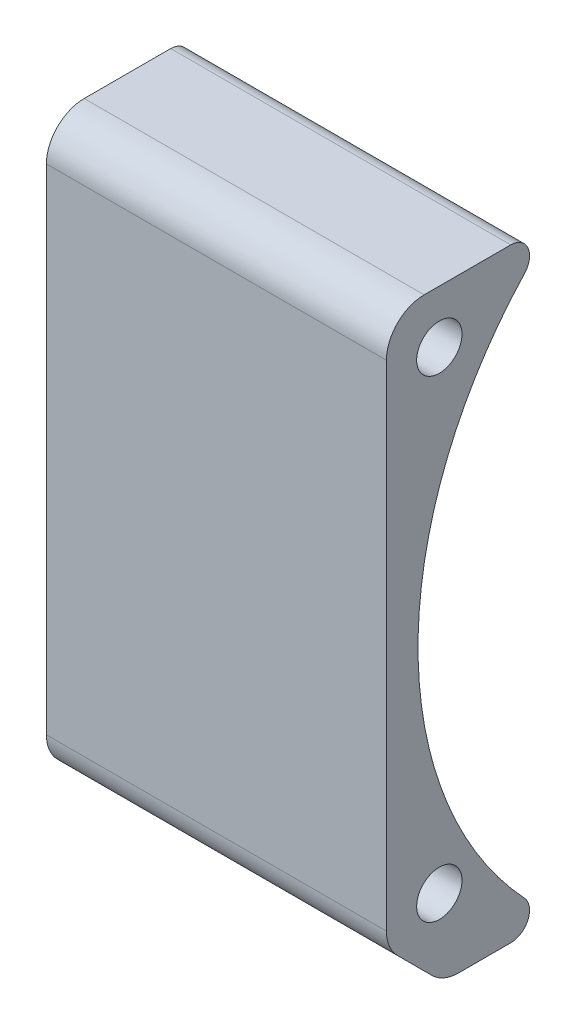
ISO-10303-21;
HEADER;
FILE_DESCRIPTION(('STEP AP214'),'2;1');
FILE_NAME('part.step','',(''),(''),'','','');
FILE_SCHEMA(('AUTOMOTIVE_DESIGN { 1 0 10303 214 1 1 1 1 }'));
ENDSEC;
DATA;
#1=APPLICATION_CONTEXT('core data for automotive mechanical design processes');
#2=APPLICATION_PROTOCOL_DEFINITION('international standard','automotive_design',2000,#1);
#3=PRODUCT_CONTEXT('',#1,'mechanical');
#4=PRODUCT('Part','Part','',(#3));
#5=PRODUCT_RELATED_PRODUCT_CATEGORY('part','',(#4));
#6=PRODUCT_DEFINITION_FORMATION('','',#4);
#7=PRODUCT_DEFINITION_CONTEXT('part definition',#1,'design');
#8=PRODUCT_DEFINITION('design','',#6,#7);
#9=PRODUCT_DEFINITION_SHAPE('','',#8);
#10=(LENGTH_UNIT() NAMED_UNIT(*) SI_UNIT(.MILLI.,.METRE.));
#11=(NAMED_UNIT(*) PLANE_ANGLE_UNIT() SI_UNIT($,.RADIAN.));
#12=(NAMED_UNIT(*) SI_UNIT($,.STERADIAN.) SOLID_ANGLE_UNIT());
#13=UNCERTAINTY_MEASURE_WITH_UNIT(LENGTH_MEASURE(1.E-05),#10,'distance_accuracy_value','');
#14=(GEOMETRIC_REPRESENTATION_CONTEXT(3) GLOBAL_UNCERTAINTY_ASSIGNED_CONTEXT((#13)) GLOBAL_UNIT_ASSIGNED_CONTEXT((#10,
#11,#12)) REPRESENTATION_CONTEXT('',''));
#15=CARTESIAN_POINT('',(0.,0.,0.));
#16=DIRECTION('',(0.,0.,1.));
#17=DIRECTION('',(1.,0.,0.));
#18=AXIS2_PLACEMENT_3D('',#15,#16,#17);
#19=CARTESIAN_POINT('',(28.575,0.,0.));
#20=DIRECTION('',(0.,1.,0.));
#21=DIRECTION('',(0.,0.,1.));
#22=AXIS2_PLACEMENT_3D('',#19,#20,#21);
#23=PLANE('',#22);
#24=DIRECTION('',(0.,0.,-1.));
#25=VECTOR('',#24,1.);
#26=CARTESIAN_POINT('',(0.,0.,0.));
#27=LINE('',#26,#25);
#28=CARTESIAN_POINT('',(0.,0.,-6.07762806053458));
#29=VERTEX_POINT('',#28);
#30=CARTESIAN_POINT('',(0.,0.,-10.4436943528125));
#31=VERTEX_POINT('',#30);
#32=EDGE_CURVE('E220',#29,#31,#27,.T.);
#33=ORIENTED_EDGE('',*,*,#32,.T.);
#34=DIRECTION('',(-1.,0.,0.));
#35=VECTOR('',#34,1.);
#36=CARTESIAN_POINT('',(28.575,0.,-10.4436943528125));
#37=LINE('',#36,#35);
#38=CARTESIAN_POINT('',(28.575,0.,-10.4436943528125));
#39=VERTEX_POINT('',#38);
#40=EDGE_CURVE('E11',#31,#39,#37,.F.);
#41=ORIENTED_EDGE('',*,*,#40,.T.);
#42=DIRECTION('',(0.,0.,-1.));
#43=VECTOR('',#42,1.);
#44=CARTESIAN_POINT('',(28.575,0.,0.));
#45=LINE('',#44,#43);
#46=CARTESIAN_POINT('',(28.575,0.,-6.07762806053458));
#47=VERTEX_POINT('',#46);
#48=EDGE_CURVE('E161',#47,#39,#45,.T.);
#49=ORIENTED_EDGE('',*,*,#48,.F.);
#50=DIRECTION('',(1.,0.,0.));
#51=VECTOR('',#50,1.);
#52=CARTESIAN_POINT('',(0.,0.,-6.07762806053458));
#53=LINE('',#52,#51);
#54=EDGE_CURVE('E187',#47,#29,#53,.F.);
#55=ORIENTED_EDGE('',*,*,#54,.T.);
#56=EDGE_LOOP('',(#33,#41,#49,#55));
#57=FACE_BOUND('',#56,.T.);
#58=ADVANCED_FACE('F51',(#57),#23,.F.);
#59=CARTESIAN_POINT('',(28.575,25.4,-35.9920889941593));
#60=DIRECTION('',(-1.,0.,0.));
#61=DIRECTION('',(0.,0.,1.));
#62=AXIS2_PLACEMENT_3D('',#59,#60,#61);
#63=CYLINDRICAL_SURFACE('',#62,33.3375);
#64=CARTESIAN_POINT('',(0.,25.4,-35.9920889941593));
#65=DIRECTION('',(-1.,0.,0.));
#66=DIRECTION('',(0.,0.,-1.));
#67=AXIS2_PLACEMENT_3D('',#64,#65,#66);
#68=CIRCLE('',#67,33.3375);
#69=CARTESIAN_POINT('',(0.,2.66988636363636,-11.6049850183283));
#70=VERTEX_POINT('',#69);
#71=CARTESIAN_POINT('',(0.,48.1301136363636,-11.6049850183282));
#72=VERTEX_POINT('',#71);
#73=EDGE_CURVE('E167',#70,#72,#68,.T.);
#74=ORIENTED_EDGE('',*,*,#73,.T.);
#75=DIRECTION('',(-1.,0.,0.));
#76=VECTOR('',#75,1.);
#77=CARTESIAN_POINT('',(28.575,48.1301136363636,-11.6049850183282));
#78=LINE('',#77,#76);
#79=CARTESIAN_POINT('',(28.575,48.1301136363636,-11.6049850183282));
#80=VERTEX_POINT('',#79);
#81=EDGE_CURVE('E72',#72,#80,#78,.F.);
#82=ORIENTED_EDGE('',*,*,#81,.T.);
#83=CARTESIAN_POINT('',(28.575,25.4,-35.9920889941593));
#84=DIRECTION('',(-1.,0.,0.));
#85=DIRECTION('',(0.,0.,-1.));
#86=AXIS2_PLACEMENT_3D('',#83,#84,#85);
#87=CIRCLE('',#86,33.3375);
#88=CARTESIAN_POINT('',(28.575,2.66988636363636,-11.6049850183283));
#89=VERTEX_POINT('',#88);
#90=EDGE_CURVE('E164',#89,#80,#87,.T.);
#91=ORIENTED_EDGE('',*,*,#90,.F.);
#92=DIRECTION('',(-1.,0.,0.));
#93=VECTOR('',#92,1.);
#94=CARTESIAN_POINT('',(28.575,2.66988636363636,-11.6049850183283));
#95=LINE('',#94,#93);
#96=EDGE_CURVE('E200',#89,#70,#95,.T.);
#97=ORIENTED_EDGE('',*,*,#96,.T.);
#98=EDGE_LOOP('',(#74,#82,#91,#97));
#99=FACE_BOUND('',#98,.T.);
#100=ADVANCED_FACE('F217',(#99),#63,.F.);
#101=CARTESIAN_POINT('',(28.575,50.8,0.));
#102=DIRECTION('',(0.,-1.,0.));
#103=DIRECTION('',(0.,0.,-1.));
#104=AXIS2_PLACEMENT_3D('',#101,#102,#103);
#105=PLANE('',#104);
#106=DIRECTION('',(0.,0.,1.));
#107=VECTOR('',#106,1.);
#108=CARTESIAN_POINT('',(28.575,50.8,0.));
#109=LINE('',#108,#107);
#110=CARTESIAN_POINT('',(28.575,50.8,-10.4436943528125));
#111=VERTEX_POINT('',#110);
#112=CARTESIAN_POINT('',(28.575,50.8,-3.175));
#113=VERTEX_POINT('',#112);
#114=EDGE_CURVE('E209',#111,#113,#109,.T.);
#115=ORIENTED_EDGE('',*,*,#114,.F.);
#116=DIRECTION('',(-1.,0.,0.));
#117=VECTOR('',#116,1.);
#118=CARTESIAN_POINT('',(28.575,50.8,-10.4436943528125));
#119=LINE('',#118,#117);
#120=CARTESIAN_POINT('',(0.,50.8,-10.4436943528125));
#121=VERTEX_POINT('',#120);
#122=EDGE_CURVE('E191',#111,#121,#119,.T.);
#123=ORIENTED_EDGE('',*,*,#122,.T.);
#124=DIRECTION('',(0.,0.,1.));
#125=VECTOR('',#124,1.);
#126=CARTESIAN_POINT('',(0.,50.8,0.));
#127=LINE('',#126,#125);
#128=CARTESIAN_POINT('',(0.,50.8,-3.175));
#129=VERTEX_POINT('',#128);
#130=EDGE_CURVE('E162',#121,#129,#127,.T.);
#131=ORIENTED_EDGE('',*,*,#130,.T.);
#132=DIRECTION('',(-1.,0.,0.));
#133=VECTOR('',#132,1.);
#134=CARTESIAN_POINT('',(28.575,50.8,-3.175));
#135=LINE('',#134,#133);
#136=EDGE_CURVE('E138',#129,#113,#135,.F.);
#137=ORIENTED_EDGE('',*,*,#136,.T.);
#138=EDGE_LOOP('',(#115,#123,#131,#137));
#139=FACE_BOUND('',#138,.T.);
#140=ADVANCED_FACE('F213',(#139),#105,.F.);
#141=CARTESIAN_POINT('',(28.575,0.,0.));
#142=DIRECTION('',(0.,0.,-1.));
#143=DIRECTION('',(-1.,0.,0.));
#144=AXIS2_PLACEMENT_3D('',#141,#142,#143);
#145=PLANE('',#144);
#146=DIRECTION('',(0.,-1.,0.));
#147=VECTOR('',#146,1.);
#148=CARTESIAN_POINT('',(0.,0.,0.));
#149=LINE('',#148,#147);
#150=CARTESIAN_POINT('',(0.,47.625,0.));
#151=VERTEX_POINT('',#150);
#152=CARTESIAN_POINT('',(0.,6.07762806053459,0.));
#153=VERTEX_POINT('',#152);
#154=EDGE_CURVE('E150',#151,#153,#149,.T.);
#155=ORIENTED_EDGE('',*,*,#154,.T.);
#156=DIRECTION('',(-1.,0.,0.));
#157=VECTOR('',#156,1.);
#158=CARTESIAN_POINT('',(28.575,6.07762806053459,0.));
#159=LINE('',#158,#157);
#160=CARTESIAN_POINT('',(28.575,6.07762806053459,0.));
#161=VERTEX_POINT('',#160);
#162=EDGE_CURVE('E154',#153,#161,#159,.F.);
#163=ORIENTED_EDGE('',*,*,#162,.T.);
#164=DIRECTION('',(0.,-1.,0.));
#165=VECTOR('',#164,1.);
#166=CARTESIAN_POINT('',(28.575,0.,0.));
#167=LINE('',#166,#165);
#168=CARTESIAN_POINT('',(28.575,47.625,0.));
#169=VERTEX_POINT('',#168);
#170=EDGE_CURVE('E153',#169,#161,#167,.T.);
#171=ORIENTED_EDGE('',*,*,#170,.F.);
#172=DIRECTION('',(-1.,0.,0.));
#173=VECTOR('',#172,1.);
#174=CARTESIAN_POINT('',(28.575,47.625,0.));
#175=LINE('',#174,#173);
#176=EDGE_CURVE('E136',#169,#151,#175,.T.);
#177=ORIENTED_EDGE('',*,*,#176,.T.);
#178=EDGE_LOOP('',(#155,#163,#171,#177));
#179=FACE_BOUND('',#178,.T.);
#180=ADVANCED_FACE('F148',(#179),#145,.F.);
#181=CARTESIAN_POINT('',(28.575,25.4,-35.9920889941593));
#182=DIRECTION('',(1.,0.,0.));
#183=DIRECTION('',(0.,0.,-1.));
#184=AXIS2_PLACEMENT_3D('',#181,#182,#183);
#185=PLANE('',#184);
#186=CARTESIAN_POINT('',(28.575,46.355,-4.445));
#187=DIRECTION('',(1.,0.,0.));
#188=DIRECTION('',(0.,0.,-1.));
#189=AXIS2_PLACEMENT_3D('',#186,#187,#188);
#190=CIRCLE('',#189,1.905);
#191=CARTESIAN_POINT('',(28.575,46.355,-6.35));
#192=VERTEX_POINT('',#191);
#193=EDGE_CURVE('E235',#192,#192,#190,.T.);
#194=ORIENTED_EDGE('',*,*,#193,.F.);
#195=EDGE_LOOP('',(#194));
#196=FACE_BOUND('',#195,.T.);
#197=CARTESIAN_POINT('',(28.575,6.60367928474841,-4.445));
#198=DIRECTION('',(1.,0.,0.));
#199=DIRECTION('',(0.,0.,-1.));
#200=AXIS2_PLACEMENT_3D('',#197,#198,#199);
#201=CIRCLE('',#200,1.905);
#202=CARTESIAN_POINT('',(28.575,6.60367928474841,-6.35));
#203=VERTEX_POINT('',#202);
#204=EDGE_CURVE('E229',#203,#203,#201,.T.);
#205=ORIENTED_EDGE('',*,*,#204,.F.);
#206=EDGE_LOOP('',(#205));
#207=FACE_BOUND('',#206,.T.);
#208=ORIENTED_EDGE('',*,*,#90,.T.);
#209=CARTESIAN_POINT('',(28.575,49.2125,-10.4436943528125));
#210=DIRECTION('',(1.,0.,0.));
#211=DIRECTION('',(0.,0.,-1.));
#212=AXIS2_PLACEMENT_3D('',#209,#210,#211);
#213=CIRCLE('',#212,1.5875);
#214=EDGE_CURVE('E59',#80,#111,#213,.T.);
#215=ORIENTED_EDGE('',*,*,#214,.T.);
#216=ORIENTED_EDGE('',*,*,#114,.T.);
#217=CARTESIAN_POINT('',(28.575,47.625,-3.175));
#218=DIRECTION('',(1.,0.,0.));
#219=DIRECTION('',(0.,0.,-1.));
#220=AXIS2_PLACEMENT_3D('',#217,#218,#219);
#221=CIRCLE('',#220,3.175);
#222=EDGE_CURVE('E176',#113,#169,#221,.T.);
#223=ORIENTED_EDGE('',*,*,#222,.T.);
#224=ORIENTED_EDGE('',*,*,#170,.T.);
#225=CARTESIAN_POINT('',(28.575,6.07762806053459,-3.175));
#226=DIRECTION('',(1.,0.,0.));
#227=DIRECTION('',(0.,0.,-1.));
#228=AXIS2_PLACEMENT_3D('',#225,#226,#227);
#229=CIRCLE('',#228,3.175);
#230=CARTESIAN_POINT('',(28.575,3.8325640302673,-0.929935969732706));
#231=VERTEX_POINT('',#230);
#232=EDGE_CURVE('E180',#161,#231,#229,.T.);
#233=ORIENTED_EDGE('',*,*,#232,.T.);
#234=DIRECTION('',(0.,0.707106781186549,0.707106781186546));
#235=VECTOR('',#234,1.);
#236=CARTESIAN_POINT('',(28.575,-2.91479449707962,-7.6772944970796));
#237=LINE('',#236,#235);
#238=CARTESIAN_POINT('',(28.575,0.929935969732714,-3.83256403026728));
#239=VERTEX_POINT('',#238);
#240=EDGE_CURVE('E155',#231,#239,#237,.F.);
#241=ORIENTED_EDGE('',*,*,#240,.T.);
#242=CARTESIAN_POINT('',(28.575,3.175,-6.07762806053458));
#243=DIRECTION('',(1.,0.,0.));
#244=DIRECTION('',(0.,0.,-1.));
#245=AXIS2_PLACEMENT_3D('',#242,#243,#244);
#246=CIRCLE('',#245,3.175);
#247=EDGE_CURVE('E178',#239,#47,#246,.T.);
#248=ORIENTED_EDGE('',*,*,#247,.T.);
#249=ORIENTED_EDGE('',*,*,#48,.T.);
#250=CARTESIAN_POINT('',(28.575,1.5875,-10.4436943528125));
#251=DIRECTION('',(1.,0.,0.));
#252=DIRECTION('',(0.,0.,-1.));
#253=AXIS2_PLACEMENT_3D('',#250,#251,#252);
#254=CIRCLE('',#253,1.5875);
#255=EDGE_CURVE('E204',#39,#89,#254,.T.);
#256=ORIENTED_EDGE('',*,*,#255,.T.);
#257=EDGE_LOOP('',(#208,#215,#216,#223,#224,#233,#241,#248,#249,#256));
#258=FACE_BOUND('',#257,.T.);
#259=ADVANCED_FACE('F208',(#196,#207,#258),#185,.T.);
#260=CARTESIAN_POINT('',(0.,25.4,-35.9920889941593));
#261=DIRECTION('',(1.,0.,0.));
#262=DIRECTION('',(0.,0.,-1.));
#263=AXIS2_PLACEMENT_3D('',#260,#261,#262);
#264=PLANE('',#263);
#265=CARTESIAN_POINT('',(0.,46.355,-4.445));
#266=DIRECTION('',(1.,0.,0.));
#267=DIRECTION('',(0.,0.,-1.));
#268=AXIS2_PLACEMENT_3D('',#265,#266,#267);
#269=CIRCLE('',#268,1.905);
#270=CARTESIAN_POINT('',(0.,46.355,-6.35));
#271=VERTEX_POINT('',#270);
#272=EDGE_CURVE('E232',#271,#271,#269,.T.);
#273=ORIENTED_EDGE('',*,*,#272,.T.);
#274=EDGE_LOOP('',(#273));
#275=FACE_BOUND('',#274,.T.);
#276=CARTESIAN_POINT('',(0.,6.60367928474841,-4.445));
#277=DIRECTION('',(1.,0.,0.));
#278=DIRECTION('',(0.,0.,-1.));
#279=AXIS2_PLACEMENT_3D('',#276,#277,#278);
#280=CIRCLE('',#279,1.905);
#281=CARTESIAN_POINT('',(0.,6.60367928474841,-6.34999999999999));
#282=VERTEX_POINT('',#281);
#283=EDGE_CURVE('E222',#282,#282,#280,.T.);
#284=ORIENTED_EDGE('',*,*,#283,.T.);
#285=EDGE_LOOP('',(#284));
#286=FACE_BOUND('',#285,.T.);
#287=ORIENTED_EDGE('',*,*,#130,.F.);
#288=CARTESIAN_POINT('',(0.,49.2125,-10.4436943528125));
#289=DIRECTION('',(1.,0.,0.));
#290=DIRECTION('',(0.,0.,-1.));
#291=AXIS2_PLACEMENT_3D('',#288,#289,#290);
#292=CIRCLE('',#291,1.5875);
#293=EDGE_CURVE('E197',#121,#72,#292,.F.);
#294=ORIENTED_EDGE('',*,*,#293,.T.);
#295=ORIENTED_EDGE('',*,*,#73,.F.);
#296=CARTESIAN_POINT('',(0.,1.5875,-10.4436943528125));
#297=DIRECTION('',(1.,0.,0.));
#298=DIRECTION('',(0.,0.,-1.));
#299=AXIS2_PLACEMENT_3D('',#296,#297,#298);
#300=CIRCLE('',#299,1.5875);
#301=EDGE_CURVE('E195',#70,#31,#300,.F.);
#302=ORIENTED_EDGE('',*,*,#301,.T.);
#303=ORIENTED_EDGE('',*,*,#32,.F.);
#304=CARTESIAN_POINT('',(0.,3.175,-6.07762806053458));
#305=DIRECTION('',(1.,0.,0.));
#306=DIRECTION('',(0.,0.,-1.));
#307=AXIS2_PLACEMENT_3D('',#304,#305,#306);
#308=CIRCLE('',#307,3.175);
#309=CARTESIAN_POINT('',(0.,0.929935969732715,-3.83256403026728));
#310=VERTEX_POINT('',#309);
#311=EDGE_CURVE('E142',#29,#310,#308,.F.);
#312=ORIENTED_EDGE('',*,*,#311,.T.);
#313=DIRECTION('',(0.,-0.707106781186549,-0.707106781186546));
#314=VECTOR('',#313,1.);
#315=CARTESIAN_POINT('',(0.,0.,-4.7625));
#316=LINE('',#315,#314);
#317=CARTESIAN_POINT('',(0.,3.8325640302673,-0.929935969732708));
#318=VERTEX_POINT('',#317);
#319=EDGE_CURVE('E171',#310,#318,#316,.F.);
#320=ORIENTED_EDGE('',*,*,#319,.T.);
#321=CARTESIAN_POINT('',(0.,6.07762806053459,-3.175));
#322=DIRECTION('',(1.,0.,0.));
#323=DIRECTION('',(0.,0.,-1.));
#324=AXIS2_PLACEMENT_3D('',#321,#322,#323);
#325=CIRCLE('',#324,3.175);
#326=EDGE_CURVE('E160',#318,#153,#325,.F.);
#327=ORIENTED_EDGE('',*,*,#326,.T.);
#328=ORIENTED_EDGE('',*,*,#154,.F.);
#329=CARTESIAN_POINT('',(0.,47.625,-3.175));
#330=DIRECTION('',(1.,0.,0.));
#331=DIRECTION('',(0.,0.,-1.));
#332=AXIS2_PLACEMENT_3D('',#329,#330,#331);
#333=CIRCLE('',#332,3.175);
#334=EDGE_CURVE('E132',#151,#129,#333,.F.);
#335=ORIENTED_EDGE('',*,*,#334,.T.);
#336=EDGE_LOOP('',(#287,#294,#295,#302,#303,#312,#320,#327,#328,#335));
#337=FACE_BOUND('',#336,.T.);
#338=ADVANCED_FACE('F157',(#275,#286,#337),#264,.F.);
#339=CARTESIAN_POINT('',(28.575,0.,-4.7625));
#340=DIRECTION('',(0.,0.707106781186547,-0.707106781186549));
#341=DIRECTION('',(-1.,0.,0.));
#342=AXIS2_PLACEMENT_3D('',#339,#340,#341);
#343=PLANE('',#342);
#344=ORIENTED_EDGE('',*,*,#240,.F.);
#345=DIRECTION('',(1.,0.,0.));
#346=VECTOR('',#345,1.);
#347=CARTESIAN_POINT('',(0.,3.8325640302673,-0.929935969732708));
#348=LINE('',#347,#346);
#349=EDGE_CURVE('E143',#231,#318,#348,.F.);
#350=ORIENTED_EDGE('',*,*,#349,.T.);
#351=ORIENTED_EDGE('',*,*,#319,.F.);
#352=DIRECTION('',(-1.,0.,0.));
#353=VECTOR('',#352,1.);
#354=CARTESIAN_POINT('',(28.575,0.929935969732715,-3.83256403026728));
#355=LINE('',#354,#353);
#356=EDGE_CURVE('E182',#310,#239,#355,.F.);
#357=ORIENTED_EDGE('',*,*,#356,.T.);
#358=EDGE_LOOP('',(#344,#350,#351,#357));
#359=FACE_BOUND('',#358,.T.);
#360=ADVANCED_FACE('F270',(#359),#343,.F.);
#361=CARTESIAN_POINT('',(28.575,6.07762806053459,-3.175));
#362=DIRECTION('',(1.,0.,0.));
#363=DIRECTION('',(0.,0.,-1.));
#364=AXIS2_PLACEMENT_3D('',#361,#362,#363);
#365=CYLINDRICAL_SURFACE('',#364,3.175);
#366=ORIENTED_EDGE('',*,*,#326,.F.);
#367=ORIENTED_EDGE('',*,*,#349,.F.);
#368=ORIENTED_EDGE('',*,*,#232,.F.);
#369=ORIENTED_EDGE('',*,*,#162,.F.);
#370=EDGE_LOOP('',(#366,#367,#368,#369));
#371=FACE_BOUND('',#370,.T.);
#372=ADVANCED_FACE('F275',(#371),#365,.T.);
#373=CARTESIAN_POINT('',(28.575,3.175,-6.07762806053458));
#374=DIRECTION('',(-1.,0.,0.));
#375=DIRECTION('',(0.,0.,1.));
#376=AXIS2_PLACEMENT_3D('',#373,#374,#375);
#377=CYLINDRICAL_SURFACE('',#376,3.175);
#378=ORIENTED_EDGE('',*,*,#247,.F.);
#379=ORIENTED_EDGE('',*,*,#356,.F.);
#380=ORIENTED_EDGE('',*,*,#311,.F.);
#381=ORIENTED_EDGE('',*,*,#54,.F.);
#382=EDGE_LOOP('',(#378,#379,#380,#381));
#383=FACE_BOUND('',#382,.T.);
#384=ADVANCED_FACE('F279',(#383),#377,.T.);
#385=CARTESIAN_POINT('',(28.575,47.625,-3.175));
#386=DIRECTION('',(-1.,0.,0.));
#387=DIRECTION('',(0.,0.,1.));
#388=AXIS2_PLACEMENT_3D('',#385,#386,#387);
#389=CYLINDRICAL_SURFACE('',#388,3.175);
#390=ORIENTED_EDGE('',*,*,#222,.F.);
#391=ORIENTED_EDGE('',*,*,#136,.F.);
#392=ORIENTED_EDGE('',*,*,#334,.F.);
#393=ORIENTED_EDGE('',*,*,#176,.F.);
#394=EDGE_LOOP('',(#390,#391,#392,#393));
#395=FACE_BOUND('',#394,.T.);
#396=ADVANCED_FACE('F135',(#395),#389,.T.);
#397=CARTESIAN_POINT('',(28.575,49.2125,-10.4436943528125));
#398=DIRECTION('',(-1.,0.,0.));
#399=DIRECTION('',(0.,0.,1.));
#400=AXIS2_PLACEMENT_3D('',#397,#398,#399);
#401=CYLINDRICAL_SURFACE('',#400,1.5875);
#402=ORIENTED_EDGE('',*,*,#214,.F.);
#403=ORIENTED_EDGE('',*,*,#81,.F.);
#404=ORIENTED_EDGE('',*,*,#293,.F.);
#405=ORIENTED_EDGE('',*,*,#122,.F.);
#406=EDGE_LOOP('',(#402,#403,#404,#405));
#407=FACE_BOUND('',#406,.T.);
#408=ADVANCED_FACE('F215',(#407),#401,.T.);
#409=CARTESIAN_POINT('',(28.575,1.5875,-10.4436943528125));
#410=DIRECTION('',(-1.,0.,0.));
#411=DIRECTION('',(0.,0.,1.));
#412=AXIS2_PLACEMENT_3D('',#409,#410,#411);
#413=CYLINDRICAL_SURFACE('',#412,1.5875);
#414=ORIENTED_EDGE('',*,*,#255,.F.);
#415=ORIENTED_EDGE('',*,*,#40,.F.);
#416=ORIENTED_EDGE('',*,*,#301,.F.);
#417=ORIENTED_EDGE('',*,*,#96,.F.);
#418=EDGE_LOOP('',(#414,#415,#416,#417));
#419=FACE_BOUND('',#418,.T.);
#420=ADVANCED_FACE('F53',(#419),#413,.T.);
#421=CARTESIAN_POINT('',(28.575,6.60367928474841,-4.445));
#422=DIRECTION('',(1.,0.,0.));
#423=DIRECTION('',(0.,0.,-1.));
#424=AXIS2_PLACEMENT_3D('',#421,#422,#423);
#425=CYLINDRICAL_SURFACE('',#424,1.905);
#426=ORIENTED_EDGE('',*,*,#283,.F.);
#427=EDGE_LOOP('',(#426));
#428=FACE_BOUND('',#427,.T.);
#429=ORIENTED_EDGE('',*,*,#204,.T.);
#430=EDGE_LOOP('',(#429));
#431=FACE_BOUND('',#430,.T.);
#432=ADVANCED_FACE('F247',(#428,#431),#425,.F.);
#433=CARTESIAN_POINT('',(28.575,46.355,-4.445));
#434=DIRECTION('',(1.,0.,0.));
#435=DIRECTION('',(0.,0.,-1.));
#436=AXIS2_PLACEMENT_3D('',#433,#434,#435);
#437=CYLINDRICAL_SURFACE('',#436,1.905);
#438=ORIENTED_EDGE('',*,*,#272,.F.);
#439=EDGE_LOOP('',(#438));
#440=FACE_BOUND('',#439,.T.);
#441=ORIENTED_EDGE('',*,*,#193,.T.);
#442=EDGE_LOOP('',(#441));
#443=FACE_BOUND('',#442,.T.);
#444=ADVANCED_FACE('F240',(#440,#443),#437,.F.);
#445=CLOSED_SHELL('',(#58,#100,#140,#180,#259,#338,#360,#372,#384,#396,#408,#420,#432,#444));
#446=MANIFOLD_SOLID_BREP('B2',#445);
#447=ADVANCED_BREP_SHAPE_REPRESENTATION('',(#18,#446),#14);
#448=SHAPE_DEFINITION_REPRESENTATION(#9,#447);
ENDSEC;
END-ISO-10303-21;
